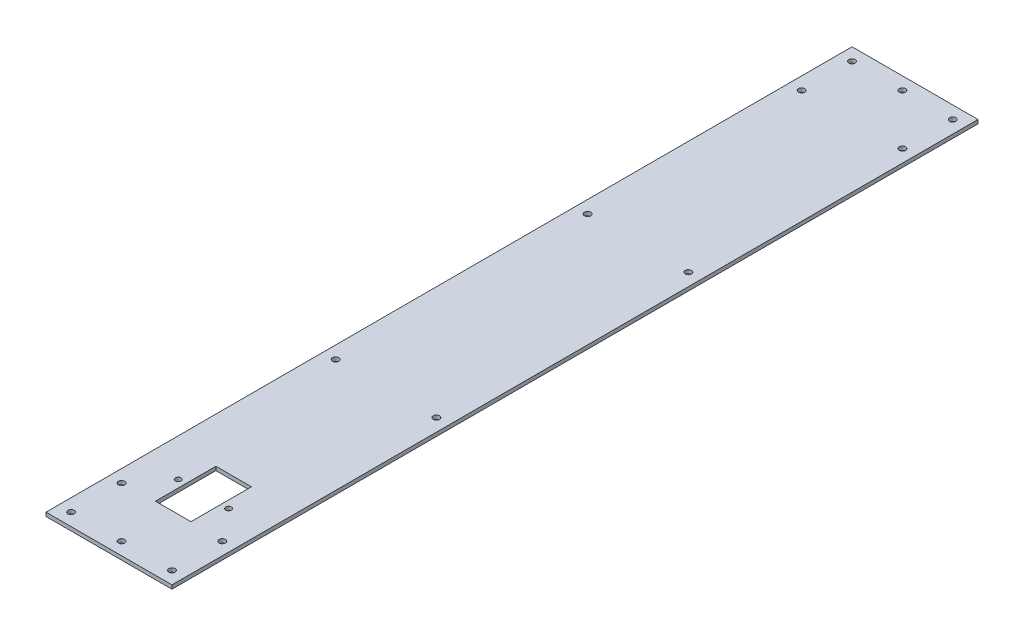
ISO-10303-21;
HEADER;
FILE_DESCRIPTION(('STEP AP214'),'2;1');
FILE_NAME('part.step','',(''),(''),'','','');
FILE_SCHEMA(('AUTOMOTIVE_DESIGN { 1 0 10303 214 1 1 1 1 }'));
ENDSEC;
DATA;
#1=APPLICATION_CONTEXT('core data for automotive mechanical design processes');
#2=APPLICATION_PROTOCOL_DEFINITION('international standard','automotive_design',2000,#1);
#3=PRODUCT_CONTEXT('',#1,'mechanical');
#4=PRODUCT('Part','Part','',(#3));
#5=PRODUCT_RELATED_PRODUCT_CATEGORY('part','',(#4));
#6=PRODUCT_DEFINITION_FORMATION('','',#4);
#7=PRODUCT_DEFINITION_CONTEXT('part definition',#1,'design');
#8=PRODUCT_DEFINITION('design','',#6,#7);
#9=PRODUCT_DEFINITION_SHAPE('','',#8);
#10=(LENGTH_UNIT() NAMED_UNIT(*) SI_UNIT(.MILLI.,.METRE.));
#11=(NAMED_UNIT(*) PLANE_ANGLE_UNIT() SI_UNIT($,.RADIAN.));
#12=(NAMED_UNIT(*) SI_UNIT($,.STERADIAN.) SOLID_ANGLE_UNIT());
#13=UNCERTAINTY_MEASURE_WITH_UNIT(LENGTH_MEASURE(1.E-05),#10,'distance_accuracy_value','');
#14=(GEOMETRIC_REPRESENTATION_CONTEXT(3) GLOBAL_UNCERTAINTY_ASSIGNED_CONTEXT((#13)) GLOBAL_UNIT_ASSIGNED_CONTEXT((#10,
#11,#12)) REPRESENTATION_CONTEXT('',''));
#15=CARTESIAN_POINT('',(0.,0.,0.));
#16=DIRECTION('',(0.,0.,1.));
#17=DIRECTION('',(1.,0.,0.));
#18=AXIS2_PLACEMENT_3D('',#15,#16,#17);
#19=CARTESIAN_POINT('',(0.,-3.,0.));
#20=DIRECTION('',(0.,-1.,0.));
#21=DIRECTION('',(1.,0.,0.));
#22=AXIS2_PLACEMENT_3D('',#19,#20,#21);
#23=PLANE('',#22);
#24=CARTESIAN_POINT('',(2.89,-3.,6.));
#25=DIRECTION('',(0.,-1.,0.));
#26=DIRECTION('',(0.,0.,-1.));
#27=AXIS2_PLACEMENT_3D('',#24,#25,#26);
#28=CIRCLE('',#27,2.25);
#29=CARTESIAN_POINT('',(2.89,-3.,3.75));
#30=VERTEX_POINT('',#29);
#31=EDGE_CURVE('E138',#30,#30,#28,.T.);
#32=ORIENTED_EDGE('',*,*,#31,.F.);
#33=EDGE_LOOP('',(#32));
#34=FACE_BOUND('',#33,.T.);
#35=CARTESIAN_POINT('',(42.89,-3.,6.));
#36=DIRECTION('',(0.,-1.,0.));
#37=DIRECTION('',(0.,0.,-1.));
#38=AXIS2_PLACEMENT_3D('',#35,#36,#37);
#39=CIRCLE('',#38,2.25);
#40=CARTESIAN_POINT('',(42.89,-3.,3.75));
#41=VERTEX_POINT('',#40);
#42=EDGE_CURVE('E135',#41,#41,#39,.T.);
#43=ORIENTED_EDGE('',*,*,#42,.F.);
#44=EDGE_LOOP('',(#43));
#45=FACE_BOUND('',#44,.T.);
#46=DIRECTION('',(0.,0.,-1.));
#47=VECTOR('',#46,1.);
#48=CARTESIAN_POINT('',(8.79,-3.,0.));
#49=LINE('',#48,#47);
#50=CARTESIAN_POINT('',(8.79,-3.,30.));
#51=VERTEX_POINT('',#50);
#52=CARTESIAN_POINT('',(8.79,-3.,-18.));
#53=VERTEX_POINT('',#52);
#54=EDGE_CURVE('E133',#51,#53,#49,.T.);
#55=ORIENTED_EDGE('',*,*,#54,.F.);
#56=DIRECTION('',(-1.,0.,0.));
#57=VECTOR('',#56,1.);
#58=CARTESIAN_POINT('',(0.,-3.,30.));
#59=LINE('',#58,#57);
#60=CARTESIAN_POINT('',(36.99,-3.,30.));
#61=VERTEX_POINT('',#60);
#62=EDGE_CURVE('E126',#61,#51,#59,.T.);
#63=ORIENTED_EDGE('',*,*,#62,.F.);
#64=DIRECTION('',(0.,0.,1.));
#65=VECTOR('',#64,1.);
#66=CARTESIAN_POINT('',(36.99,-3.,0.));
#67=LINE('',#66,#65);
#68=CARTESIAN_POINT('',(36.99,-3.,-18.));
#69=VERTEX_POINT('',#68);
#70=EDGE_CURVE('E106',#69,#61,#67,.T.);
#71=ORIENTED_EDGE('',*,*,#70,.F.);
#72=DIRECTION('',(1.,0.,0.));
#73=VECTOR('',#72,1.);
#74=CARTESIAN_POINT('',(0.,-3.,-18.));
#75=LINE('',#74,#73);
#76=EDGE_CURVE('E131',#53,#69,#75,.T.);
#77=ORIENTED_EDGE('',*,*,#76,.F.);
#78=EDGE_LOOP('',(#55,#63,#71,#77));
#79=FACE_BOUND('',#78,.T.);
#80=CARTESIAN_POINT('',(22.8925619834711,-3.,70.9917355371901));
#81=DIRECTION('',(0.,-1.,0.));
#82=DIRECTION('',(0.,0.,-1.));
#83=AXIS2_PLACEMENT_3D('',#80,#81,#82);
#84=CIRCLE('',#83,2.5);
#85=CARTESIAN_POINT('',(22.8925619834711,-3.,68.4917355371901));
#86=VERTEX_POINT('',#85);
#87=EDGE_CURVE('E11',#86,#86,#84,.T.);
#88=ORIENTED_EDGE('',*,*,#87,.F.);
#89=EDGE_LOOP('',(#88));
#90=FACE_BOUND('',#89,.T.);
#91=CARTESIAN_POINT('',(-17.1074380165289,-3.,30.9917355371901));
#92=DIRECTION('',(0.,-1.,0.));
#93=DIRECTION('',(0.,0.,-1.));
#94=AXIS2_PLACEMENT_3D('',#91,#92,#93);
#95=CIRCLE('',#94,2.5);
#96=CARTESIAN_POINT('',(-17.1074380165289,-3.,28.4917355371901));
#97=VERTEX_POINT('',#96);
#98=EDGE_CURVE('E43',#97,#97,#95,.T.);
#99=ORIENTED_EDGE('',*,*,#98,.F.);
#100=EDGE_LOOP('',(#99));
#101=FACE_BOUND('',#100,.T.);
#102=CARTESIAN_POINT('',(62.8925619834713,-3.,-509.00826446281));
#103=DIRECTION('',(0.,1.,0.));
#104=DIRECTION('',(0.,0.,-1.));
#105=AXIS2_PLACEMENT_3D('',#102,#103,#104);
#106=CIRCLE('',#105,2.5);
#107=CARTESIAN_POINT('',(62.8925619834713,-3.,-511.50826446281));
#108=VERTEX_POINT('',#107);
#109=EDGE_CURVE('E248',#108,#108,#106,.T.);
#110=ORIENTED_EDGE('',*,*,#109,.T.);
#111=EDGE_LOOP('',(#110));
#112=FACE_BOUND('',#111,.T.);
#113=CARTESIAN_POINT('',(22.8925619834712,-3.,-549.00826446281));
#114=DIRECTION('',(0.,-1.,0.));
#115=DIRECTION('',(0.,0.,-1.));
#116=AXIS2_PLACEMENT_3D('',#113,#114,#115);
#117=CIRCLE('',#116,2.49999999999994);
#118=CARTESIAN_POINT('',(22.8925619834712,-3.,-551.50826446281));
#119=VERTEX_POINT('',#118);
#120=EDGE_CURVE('E245',#119,#119,#117,.T.);
#121=ORIENTED_EDGE('',*,*,#120,.F.);
#122=EDGE_LOOP('',(#121));
#123=FACE_BOUND('',#122,.T.);
#124=CARTESIAN_POINT('',(-17.1074380165289,-3.,-509.00826446281));
#125=DIRECTION('',(0.,-1.,0.));
#126=DIRECTION('',(0.,0.,-1.));
#127=AXIS2_PLACEMENT_3D('',#124,#125,#126);
#128=CIRCLE('',#127,2.5);
#129=CARTESIAN_POINT('',(-17.1074380165289,-3.,-511.50826446281));
#130=VERTEX_POINT('',#129);
#131=EDGE_CURVE('E242',#130,#130,#128,.T.);
#132=ORIENTED_EDGE('',*,*,#131,.F.);
#133=EDGE_LOOP('',(#132));
#134=FACE_BOUND('',#133,.T.);
#135=CARTESIAN_POINT('',(62.8925619834712,-3.,-139.00826446281));
#136=DIRECTION('',(0.,1.,0.));
#137=DIRECTION('',(0.,0.,-1.));
#138=AXIS2_PLACEMENT_3D('',#135,#136,#137);
#139=CIRCLE('',#138,2.5);
#140=CARTESIAN_POINT('',(62.8925619834712,-3.,-141.50826446281));
#141=VERTEX_POINT('',#140);
#142=EDGE_CURVE('E239',#141,#141,#139,.T.);
#143=ORIENTED_EDGE('',*,*,#142,.T.);
#144=EDGE_LOOP('',(#143));
#145=FACE_BOUND('',#144,.T.);
#146=CARTESIAN_POINT('',(62.8925619834712,-3.,70.9917355371901));
#147=DIRECTION('',(0.,1.,0.));
#148=DIRECTION('',(0.,0.,-1.));
#149=AXIS2_PLACEMENT_3D('',#146,#147,#148);
#150=CIRCLE('',#149,2.5);
#151=CARTESIAN_POINT('',(62.8925619834712,-3.,68.4917355371901));
#152=VERTEX_POINT('',#151);
#153=EDGE_CURVE('E236',#152,#152,#150,.T.);
#154=ORIENTED_EDGE('',*,*,#153,.T.);
#155=EDGE_LOOP('',(#154));
#156=FACE_BOUND('',#155,.T.);
#157=CARTESIAN_POINT('',(-17.1074380165289,-3.,70.9917355371901));
#158=DIRECTION('',(0.,-1.,0.));
#159=DIRECTION('',(1.,0.,0.));
#160=AXIS2_PLACEMENT_3D('',#157,#158,#159);
#161=CIRCLE('',#160,2.5);
#162=CARTESIAN_POINT('',(-14.6074380165289,-3.,70.9917355371901));
#163=VERTEX_POINT('',#162);
#164=EDGE_CURVE('E233',#163,#163,#161,.T.);
#165=ORIENTED_EDGE('',*,*,#164,.F.);
#166=EDGE_LOOP('',(#165));
#167=FACE_BOUND('',#166,.T.);
#168=CARTESIAN_POINT('',(-17.1074380165289,-3.,-339.00826446281));
#169=DIRECTION('',(0.,-1.,0.));
#170=DIRECTION('',(1.,0.,0.));
#171=AXIS2_PLACEMENT_3D('',#168,#169,#170);
#172=CIRCLE('',#171,2.5);
#173=CARTESIAN_POINT('',(-14.6074380165289,-3.,-339.00826446281));
#174=VERTEX_POINT('',#173);
#175=EDGE_CURVE('E230',#174,#174,#172,.T.);
#176=ORIENTED_EDGE('',*,*,#175,.F.);
#177=EDGE_LOOP('',(#176));
#178=FACE_BOUND('',#177,.T.);
#179=CARTESIAN_POINT('',(-17.1074380165289,-3.,-549.00826446281));
#180=DIRECTION('',(0.,-1.,0.));
#181=DIRECTION('',(1.,0.,0.));
#182=AXIS2_PLACEMENT_3D('',#179,#180,#181);
#183=CIRCLE('',#182,2.5);
#184=CARTESIAN_POINT('',(-14.6074380165289,-3.,-549.00826446281));
#185=VERTEX_POINT('',#184);
#186=EDGE_CURVE('E227',#185,#185,#183,.T.);
#187=ORIENTED_EDGE('',*,*,#186,.F.);
#188=EDGE_LOOP('',(#187));
#189=FACE_BOUND('',#188,.T.);
#190=CARTESIAN_POINT('',(-17.1074380165289,-3.,-139.00826446281));
#191=DIRECTION('',(0.,-1.,0.));
#192=DIRECTION('',(1.,0.,0.));
#193=AXIS2_PLACEMENT_3D('',#190,#191,#192);
#194=CIRCLE('',#193,2.5);
#195=CARTESIAN_POINT('',(-14.6074380165289,-3.,-139.00826446281));
#196=VERTEX_POINT('',#195);
#197=EDGE_CURVE('E224',#196,#196,#194,.T.);
#198=ORIENTED_EDGE('',*,*,#197,.F.);
#199=EDGE_LOOP('',(#198));
#200=FACE_BOUND('',#199,.T.);
#201=DIRECTION('',(0.,0.,-1.));
#202=VECTOR('',#201,1.);
#203=CARTESIAN_POINT('',(-27.1074380165289,-3.,80.9917355371901));
#204=LINE('',#203,#202);
#205=CARTESIAN_POINT('',(-27.1074380165289,-3.,80.9917355371901));
#206=VERTEX_POINT('',#205);
#207=CARTESIAN_POINT('',(-27.1074380165288,-3.,-559.00826446281));
#208=VERTEX_POINT('',#207);
#209=EDGE_CURVE('E222',#206,#208,#204,.T.);
#210=ORIENTED_EDGE('',*,*,#209,.T.);
#211=DIRECTION('',(1.,0.,0.));
#212=VECTOR('',#211,1.);
#213=CARTESIAN_POINT('',(-27.1074380165288,-3.,-559.00826446281));
#214=LINE('',#213,#212);
#215=CARTESIAN_POINT('',(72.8925619834712,-3.,-559.00826446281));
#216=VERTEX_POINT('',#215);
#217=EDGE_CURVE('E220',#208,#216,#214,.T.);
#218=ORIENTED_EDGE('',*,*,#217,.T.);
#219=DIRECTION('',(0.,0.,1.));
#220=VECTOR('',#219,1.);
#221=CARTESIAN_POINT('',(72.8925619834711,-3.,80.9917355371901));
#222=LINE('',#221,#220);
#223=CARTESIAN_POINT('',(72.8925619834711,-3.,80.9917355371901));
#224=VERTEX_POINT('',#223);
#225=EDGE_CURVE('E218',#216,#224,#222,.T.);
#226=ORIENTED_EDGE('',*,*,#225,.T.);
#227=DIRECTION('',(-1.,0.,0.));
#228=VECTOR('',#227,1.);
#229=CARTESIAN_POINT('',(-27.1074380165289,-3.,80.9917355371901));
#230=LINE('',#229,#228);
#231=EDGE_CURVE('E216',#224,#206,#230,.T.);
#232=ORIENTED_EDGE('',*,*,#231,.T.);
#233=EDGE_LOOP('',(#210,#218,#226,#232));
#234=FACE_BOUND('',#233,.T.);
#235=CARTESIAN_POINT('',(62.8925619834712,-3.,-339.00826446281));
#236=DIRECTION('',(0.,-1.,0.));
#237=DIRECTION('',(0.,0.,-1.));
#238=AXIS2_PLACEMENT_3D('',#235,#236,#237);
#239=CIRCLE('',#238,2.5);
#240=CARTESIAN_POINT('',(62.8925619834712,-3.,-341.50826446281));
#241=VERTEX_POINT('',#240);
#242=EDGE_CURVE('E213',#241,#241,#239,.T.);
#243=ORIENTED_EDGE('',*,*,#242,.F.);
#244=EDGE_LOOP('',(#243));
#245=FACE_BOUND('',#244,.T.);
#246=CARTESIAN_POINT('',(62.8925619834712,-3.,-549.00826446281));
#247=DIRECTION('',(0.,-1.,0.));
#248=DIRECTION('',(0.,0.,-1.));
#249=AXIS2_PLACEMENT_3D('',#246,#247,#248);
#250=CIRCLE('',#249,2.5);
#251=CARTESIAN_POINT('',(62.8925619834712,-3.,-551.50826446281));
#252=VERTEX_POINT('',#251);
#253=EDGE_CURVE('E210',#252,#252,#250,.T.);
#254=ORIENTED_EDGE('',*,*,#253,.F.);
#255=EDGE_LOOP('',(#254));
#256=FACE_BOUND('',#255,.T.);
#257=CARTESIAN_POINT('',(62.8925619834711,-3.,30.9917355371901));
#258=DIRECTION('',(0.,1.,0.));
#259=DIRECTION('',(0.,0.,-1.));
#260=AXIS2_PLACEMENT_3D('',#257,#258,#259);
#261=CIRCLE('',#260,2.5);
#262=CARTESIAN_POINT('',(62.8925619834711,-3.,28.4917355371901));
#263=VERTEX_POINT('',#262);
#264=EDGE_CURVE('E207',#263,#263,#261,.T.);
#265=ORIENTED_EDGE('',*,*,#264,.T.);
#266=EDGE_LOOP('',(#265));
#267=FACE_BOUND('',#266,.T.);
#268=ADVANCED_FACE('F36',(#34,#45,#79,#90,#101,#112,#123,#134,#145,#156,#167,#178,#189,#200,
#234,#245,#256,#267),#23,.T.);
#269=CARTESIAN_POINT('',(0.,0.,0.));
#270=DIRECTION('',(0.,-1.,0.));
#271=DIRECTION('',(1.,0.,0.));
#272=AXIS2_PLACEMENT_3D('',#269,#270,#271);
#273=PLANE('',#272);
#274=CARTESIAN_POINT('',(2.89,0.,6.));
#275=DIRECTION('',(0.,1.,0.));
#276=DIRECTION('',(0.,0.,1.));
#277=AXIS2_PLACEMENT_3D('',#274,#275,#276);
#278=CIRCLE('',#277,2.25);
#279=CARTESIAN_POINT('',(2.89,0.,8.25));
#280=VERTEX_POINT('',#279);
#281=EDGE_CURVE('E390',#280,#280,#278,.T.);
#282=ORIENTED_EDGE('',*,*,#281,.F.);
#283=EDGE_LOOP('',(#282));
#284=FACE_BOUND('',#283,.T.);
#285=CARTESIAN_POINT('',(42.89,0.,6.));
#286=DIRECTION('',(0.,1.,0.));
#287=DIRECTION('',(0.,0.,1.));
#288=AXIS2_PLACEMENT_3D('',#285,#286,#287);
#289=CIRCLE('',#288,2.25);
#290=CARTESIAN_POINT('',(42.89,0.,8.25));
#291=VERTEX_POINT('',#290);
#292=EDGE_CURVE('E389',#291,#291,#289,.T.);
#293=ORIENTED_EDGE('',*,*,#292,.F.);
#294=EDGE_LOOP('',(#293));
#295=FACE_BOUND('',#294,.T.);
#296=DIRECTION('',(1.,0.,0.));
#297=VECTOR('',#296,1.);
#298=CARTESIAN_POINT('',(8.79,0.,30.));
#299=LINE('',#298,#297);
#300=CARTESIAN_POINT('',(8.79,0.,30.));
#301=VERTEX_POINT('',#300);
#302=CARTESIAN_POINT('',(36.99,0.,30.));
#303=VERTEX_POINT('',#302);
#304=EDGE_CURVE('E112',#301,#303,#299,.T.);
#305=ORIENTED_EDGE('',*,*,#304,.F.);
#306=DIRECTION('',(0.,0.,1.));
#307=VECTOR('',#306,1.);
#308=CARTESIAN_POINT('',(8.79,0.,-18.));
#309=LINE('',#308,#307);
#310=CARTESIAN_POINT('',(8.79,0.,-18.));
#311=VERTEX_POINT('',#310);
#312=EDGE_CURVE('E58',#311,#301,#309,.T.);
#313=ORIENTED_EDGE('',*,*,#312,.F.);
#314=DIRECTION('',(-1.,0.,0.));
#315=VECTOR('',#314,1.);
#316=CARTESIAN_POINT('',(8.79,0.,-18.));
#317=LINE('',#316,#315);
#318=CARTESIAN_POINT('',(36.99,0.,-18.));
#319=VERTEX_POINT('',#318);
#320=EDGE_CURVE('E119',#319,#311,#317,.T.);
#321=ORIENTED_EDGE('',*,*,#320,.F.);
#322=DIRECTION('',(0.,0.,-1.));
#323=VECTOR('',#322,1.);
#324=CARTESIAN_POINT('',(36.99,0.,-18.));
#325=LINE('',#324,#323);
#326=EDGE_CURVE('E103',#303,#319,#325,.T.);
#327=ORIENTED_EDGE('',*,*,#326,.F.);
#328=EDGE_LOOP('',(#305,#313,#321,#327));
#329=FACE_BOUND('',#328,.T.);
#330=CARTESIAN_POINT('',(22.8925619834711,0.,70.9917355371901));
#331=DIRECTION('',(0.,-1.,0.));
#332=DIRECTION('',(0.,0.,-1.));
#333=AXIS2_PLACEMENT_3D('',#330,#331,#332);
#334=CIRCLE('',#333,2.5);
#335=CARTESIAN_POINT('',(22.8925619834711,0.,68.4917355371901));
#336=VERTEX_POINT('',#335);
#337=EDGE_CURVE('E204',#336,#336,#334,.T.);
#338=ORIENTED_EDGE('',*,*,#337,.T.);
#339=EDGE_LOOP('',(#338));
#340=FACE_BOUND('',#339,.T.);
#341=CARTESIAN_POINT('',(-17.1074380165289,0.,30.9917355371901));
#342=DIRECTION('',(0.,-1.,0.));
#343=DIRECTION('',(0.,0.,-1.));
#344=AXIS2_PLACEMENT_3D('',#341,#342,#343);
#345=CIRCLE('',#344,2.5);
#346=CARTESIAN_POINT('',(-17.1074380165289,0.,28.4917355371901));
#347=VERTEX_POINT('',#346);
#348=EDGE_CURVE('E201',#347,#347,#345,.T.);
#349=ORIENTED_EDGE('',*,*,#348,.T.);
#350=EDGE_LOOP('',(#349));
#351=FACE_BOUND('',#350,.T.);
#352=CARTESIAN_POINT('',(22.8925619834712,0.,-549.00826446281));
#353=DIRECTION('',(0.,-1.,0.));
#354=DIRECTION('',(0.,0.,-1.));
#355=AXIS2_PLACEMENT_3D('',#352,#353,#354);
#356=CIRCLE('',#355,2.49999999999994);
#357=CARTESIAN_POINT('',(22.8925619834712,0.,-551.50826446281));
#358=VERTEX_POINT('',#357);
#359=EDGE_CURVE('E198',#358,#358,#356,.T.);
#360=ORIENTED_EDGE('',*,*,#359,.T.);
#361=EDGE_LOOP('',(#360));
#362=FACE_BOUND('',#361,.T.);
#363=CARTESIAN_POINT('',(-17.1074380165289,0.,-509.00826446281));
#364=DIRECTION('',(0.,-1.,0.));
#365=DIRECTION('',(0.,0.,-1.));
#366=AXIS2_PLACEMENT_3D('',#363,#364,#365);
#367=CIRCLE('',#366,2.5);
#368=CARTESIAN_POINT('',(-17.1074380165289,0.,-511.50826446281));
#369=VERTEX_POINT('',#368);
#370=EDGE_CURVE('E195',#369,#369,#367,.T.);
#371=ORIENTED_EDGE('',*,*,#370,.T.);
#372=EDGE_LOOP('',(#371));
#373=FACE_BOUND('',#372,.T.);
#374=CARTESIAN_POINT('',(62.8925619834712,0.,-339.00826446281));
#375=DIRECTION('',(0.,-1.,0.));
#376=DIRECTION('',(0.,0.,-1.));
#377=AXIS2_PLACEMENT_3D('',#374,#375,#376);
#378=CIRCLE('',#377,2.5);
#379=CARTESIAN_POINT('',(62.8925619834712,0.,-341.50826446281));
#380=VERTEX_POINT('',#379);
#381=EDGE_CURVE('E192',#380,#380,#378,.T.);
#382=ORIENTED_EDGE('',*,*,#381,.T.);
#383=EDGE_LOOP('',(#382));
#384=FACE_BOUND('',#383,.T.);
#385=CARTESIAN_POINT('',(62.8925619834712,0.,-139.00826446281));
#386=DIRECTION('',(0.,-1.,0.));
#387=DIRECTION('',(0.,0.,-1.));
#388=AXIS2_PLACEMENT_3D('',#385,#386,#387);
#389=CIRCLE('',#388,2.5);
#390=CARTESIAN_POINT('',(62.8925619834712,0.,-141.50826446281));
#391=VERTEX_POINT('',#390);
#392=EDGE_CURVE('E189',#391,#391,#389,.F.);
#393=ORIENTED_EDGE('',*,*,#392,.F.);
#394=EDGE_LOOP('',(#393));
#395=FACE_BOUND('',#394,.T.);
#396=CARTESIAN_POINT('',(62.8925619834712,0.,70.9917355371901));
#397=DIRECTION('',(0.,-1.,0.));
#398=DIRECTION('',(0.,0.,-1.));
#399=AXIS2_PLACEMENT_3D('',#396,#397,#398);
#400=CIRCLE('',#399,2.5);
#401=CARTESIAN_POINT('',(62.8925619834712,0.,68.4917355371901));
#402=VERTEX_POINT('',#401);
#403=EDGE_CURVE('E186',#402,#402,#400,.F.);
#404=ORIENTED_EDGE('',*,*,#403,.F.);
#405=EDGE_LOOP('',(#404));
#406=FACE_BOUND('',#405,.T.);
#407=CARTESIAN_POINT('',(-17.1074380165289,0.,70.9917355371901));
#408=DIRECTION('',(0.,-1.,0.));
#409=DIRECTION('',(1.,0.,0.));
#410=AXIS2_PLACEMENT_3D('',#407,#408,#409);
#411=CIRCLE('',#410,2.5);
#412=CARTESIAN_POINT('',(-14.6074380165289,0.,70.9917355371901));
#413=VERTEX_POINT('',#412);
#414=EDGE_CURVE('E183',#413,#413,#411,.T.);
#415=ORIENTED_EDGE('',*,*,#414,.T.);
#416=EDGE_LOOP('',(#415));
#417=FACE_BOUND('',#416,.T.);
#418=CARTESIAN_POINT('',(-17.1074380165289,0.,-339.00826446281));
#419=DIRECTION('',(0.,-1.,0.));
#420=DIRECTION('',(1.,0.,0.));
#421=AXIS2_PLACEMENT_3D('',#418,#419,#420);
#422=CIRCLE('',#421,2.5);
#423=CARTESIAN_POINT('',(-14.6074380165289,0.,-339.00826446281));
#424=VERTEX_POINT('',#423);
#425=EDGE_CURVE('E180',#424,#424,#422,.T.);
#426=ORIENTED_EDGE('',*,*,#425,.T.);
#427=EDGE_LOOP('',(#426));
#428=FACE_BOUND('',#427,.T.);
#429=CARTESIAN_POINT('',(-17.1074380165289,0.,-549.00826446281));
#430=DIRECTION('',(0.,-1.,0.));
#431=DIRECTION('',(1.,0.,0.));
#432=AXIS2_PLACEMENT_3D('',#429,#430,#431);
#433=CIRCLE('',#432,2.5);
#434=CARTESIAN_POINT('',(-14.6074380165289,0.,-549.00826446281));
#435=VERTEX_POINT('',#434);
#436=EDGE_CURVE('E177',#435,#435,#433,.T.);
#437=ORIENTED_EDGE('',*,*,#436,.T.);
#438=EDGE_LOOP('',(#437));
#439=FACE_BOUND('',#438,.T.);
#440=CARTESIAN_POINT('',(-17.1074380165289,0.,-139.00826446281));
#441=DIRECTION('',(0.,-1.,0.));
#442=DIRECTION('',(1.,0.,0.));
#443=AXIS2_PLACEMENT_3D('',#440,#441,#442);
#444=CIRCLE('',#443,2.5);
#445=CARTESIAN_POINT('',(-14.6074380165289,0.,-139.00826446281));
#446=VERTEX_POINT('',#445);
#447=EDGE_CURVE('E174',#446,#446,#444,.T.);
#448=ORIENTED_EDGE('',*,*,#447,.T.);
#449=EDGE_LOOP('',(#448));
#450=FACE_BOUND('',#449,.T.);
#451=DIRECTION('',(0.,0.,-1.));
#452=VECTOR('',#451,1.);
#453=CARTESIAN_POINT('',(-27.1074380165289,0.,80.9917355371901));
#454=LINE('',#453,#452);
#455=CARTESIAN_POINT('',(-27.1074380165289,0.,80.9917355371901));
#456=VERTEX_POINT('',#455);
#457=CARTESIAN_POINT('',(-27.1074380165288,0.,-559.00826446281));
#458=VERTEX_POINT('',#457);
#459=EDGE_CURVE('E171',#456,#458,#454,.T.);
#460=ORIENTED_EDGE('',*,*,#459,.F.);
#461=DIRECTION('',(-1.,0.,0.));
#462=VECTOR('',#461,1.);
#463=CARTESIAN_POINT('',(-27.1074380165289,0.,80.9917355371901));
#464=LINE('',#463,#462);
#465=CARTESIAN_POINT('',(72.8925619834711,0.,80.9917355371901));
#466=VERTEX_POINT('',#465);
#467=EDGE_CURVE('E168',#466,#456,#464,.T.);
#468=ORIENTED_EDGE('',*,*,#467,.F.);
#469=DIRECTION('',(0.,0.,1.));
#470=VECTOR('',#469,1.);
#471=CARTESIAN_POINT('',(72.8925619834711,0.,80.9917355371901));
#472=LINE('',#471,#470);
#473=CARTESIAN_POINT('',(72.8925619834712,0.,-559.00826446281));
#474=VERTEX_POINT('',#473);
#475=EDGE_CURVE('E165',#474,#466,#472,.T.);
#476=ORIENTED_EDGE('',*,*,#475,.F.);
#477=DIRECTION('',(1.,0.,0.));
#478=VECTOR('',#477,1.);
#479=CARTESIAN_POINT('',(-27.1074380165288,0.,-559.00826446281));
#480=LINE('',#479,#478);
#481=EDGE_CURVE('E162',#458,#474,#480,.T.);
#482=ORIENTED_EDGE('',*,*,#481,.F.);
#483=EDGE_LOOP('',(#460,#468,#476,#482));
#484=FACE_BOUND('',#483,.T.);
#485=CARTESIAN_POINT('',(62.8925619834712,0.,-549.00826446281));
#486=DIRECTION('',(0.,-1.,0.));
#487=DIRECTION('',(0.,0.,-1.));
#488=AXIS2_PLACEMENT_3D('',#485,#486,#487);
#489=CIRCLE('',#488,2.5);
#490=CARTESIAN_POINT('',(62.8925619834712,0.,-551.50826446281));
#491=VERTEX_POINT('',#490);
#492=EDGE_CURVE('E159',#491,#491,#489,.T.);
#493=ORIENTED_EDGE('',*,*,#492,.T.);
#494=EDGE_LOOP('',(#493));
#495=FACE_BOUND('',#494,.T.);
#496=CARTESIAN_POINT('',(62.8925619834713,0.,-509.00826446281));
#497=DIRECTION('',(0.,-1.,0.));
#498=DIRECTION('',(0.,0.,-1.));
#499=AXIS2_PLACEMENT_3D('',#496,#497,#498);
#500=CIRCLE('',#499,2.5);
#501=CARTESIAN_POINT('',(62.8925619834713,0.,-511.50826446281));
#502=VERTEX_POINT('',#501);
#503=EDGE_CURVE('E156',#502,#502,#500,.F.);
#504=ORIENTED_EDGE('',*,*,#503,.F.);
#505=EDGE_LOOP('',(#504));
#506=FACE_BOUND('',#505,.T.);
#507=CARTESIAN_POINT('',(62.8925619834711,0.,30.9917355371901));
#508=DIRECTION('',(0.,-1.,0.));
#509=DIRECTION('',(0.,0.,-1.));
#510=AXIS2_PLACEMENT_3D('',#507,#508,#509);
#511=CIRCLE('',#510,2.5);
#512=CARTESIAN_POINT('',(62.8925619834711,0.,28.4917355371901));
#513=VERTEX_POINT('',#512);
#514=EDGE_CURVE('E153',#513,#513,#511,.F.);
#515=ORIENTED_EDGE('',*,*,#514,.F.);
#516=EDGE_LOOP('',(#515));
#517=FACE_BOUND('',#516,.T.);
#518=ADVANCED_FACE('F116',(#284,#295,#329,#340,#351,#362,#373,#384,#395,#406,#417,#428,#439,
#450,#484,#495,#506,#517),#273,.F.);
#519=CARTESIAN_POINT('',(-27.1074380165289,-3.,80.9917355371901));
#520=DIRECTION('',(1.,0.,0.));
#521=DIRECTION('',(0.,0.,1.));
#522=AXIS2_PLACEMENT_3D('',#519,#520,#521);
#523=PLANE('',#522);
#524=ORIENTED_EDGE('',*,*,#459,.T.);
#525=DIRECTION('',(0.,1.,0.));
#526=VECTOR('',#525,1.);
#527=CARTESIAN_POINT('',(-27.1074380165288,-3.,-559.00826446281));
#528=LINE('',#527,#526);
#529=EDGE_CURVE('E150',#208,#458,#528,.T.);
#530=ORIENTED_EDGE('',*,*,#529,.F.);
#531=ORIENTED_EDGE('',*,*,#209,.F.);
#532=DIRECTION('',(0.,1.,0.));
#533=VECTOR('',#532,1.);
#534=CARTESIAN_POINT('',(-27.1074380165289,-3.,80.9917355371901));
#535=LINE('',#534,#533);
#536=EDGE_CURVE('E147',#206,#456,#535,.T.);
#537=ORIENTED_EDGE('',*,*,#536,.T.);
#538=EDGE_LOOP('',(#524,#530,#531,#537));
#539=FACE_BOUND('',#538,.T.);
#540=ADVANCED_FACE('F294',(#539),#523,.F.);
#541=CARTESIAN_POINT('',(-27.1074380165288,-3.,-559.00826446281));
#542=DIRECTION('',(0.,0.,1.));
#543=DIRECTION('',(0.,-1.,0.));
#544=AXIS2_PLACEMENT_3D('',#541,#542,#543);
#545=PLANE('',#544);
#546=ORIENTED_EDGE('',*,*,#481,.T.);
#547=DIRECTION('',(0.,1.,0.));
#548=VECTOR('',#547,1.);
#549=CARTESIAN_POINT('',(72.8925619834712,-3.,-559.00826446281));
#550=LINE('',#549,#548);
#551=EDGE_CURVE('E144',#216,#474,#550,.T.);
#552=ORIENTED_EDGE('',*,*,#551,.F.);
#553=ORIENTED_EDGE('',*,*,#217,.F.);
#554=ORIENTED_EDGE('',*,*,#529,.T.);
#555=EDGE_LOOP('',(#546,#552,#553,#554));
#556=FACE_BOUND('',#555,.T.);
#557=ADVANCED_FACE('F299',(#556),#545,.F.);
#558=CARTESIAN_POINT('',(-27.1074380165289,-3.,80.9917355371901));
#559=DIRECTION('',(0.,0.,-1.));
#560=DIRECTION('',(0.,1.,0.));
#561=AXIS2_PLACEMENT_3D('',#558,#559,#560);
#562=PLANE('',#561);
#563=ORIENTED_EDGE('',*,*,#467,.T.);
#564=ORIENTED_EDGE('',*,*,#536,.F.);
#565=ORIENTED_EDGE('',*,*,#231,.F.);
#566=DIRECTION('',(0.,1.,0.));
#567=VECTOR('',#566,1.);
#568=CARTESIAN_POINT('',(72.8925619834711,-3.,80.9917355371901));
#569=LINE('',#568,#567);
#570=EDGE_CURVE('E141',#224,#466,#569,.T.);
#571=ORIENTED_EDGE('',*,*,#570,.T.);
#572=EDGE_LOOP('',(#563,#564,#565,#571));
#573=FACE_BOUND('',#572,.T.);
#574=ADVANCED_FACE('F307',(#573),#562,.F.);
#575=CARTESIAN_POINT('',(-17.1074380165289,0.,-139.00826446281));
#576=DIRECTION('',(0.,-1.,0.));
#577=DIRECTION('',(1.,0.,0.));
#578=AXIS2_PLACEMENT_3D('',#575,#576,#577);
#579=CYLINDRICAL_SURFACE('',#578,2.5);
#580=ORIENTED_EDGE('',*,*,#447,.F.);
#581=EDGE_LOOP('',(#580));
#582=FACE_BOUND('',#581,.T.);
#583=ORIENTED_EDGE('',*,*,#197,.T.);
#584=EDGE_LOOP('',(#583));
#585=FACE_BOUND('',#584,.T.);
#586=ADVANCED_FACE('F311',(#582,#585),#579,.F.);
#587=CARTESIAN_POINT('',(-17.1074380165289,0.,-549.00826446281));
#588=DIRECTION('',(0.,-1.,0.));
#589=DIRECTION('',(1.,0.,0.));
#590=AXIS2_PLACEMENT_3D('',#587,#588,#589);
#591=CYLINDRICAL_SURFACE('',#590,2.5);
#592=ORIENTED_EDGE('',*,*,#436,.F.);
#593=EDGE_LOOP('',(#592));
#594=FACE_BOUND('',#593,.T.);
#595=ORIENTED_EDGE('',*,*,#186,.T.);
#596=EDGE_LOOP('',(#595));
#597=FACE_BOUND('',#596,.T.);
#598=ADVANCED_FACE('F315',(#594,#597),#591,.F.);
#599=CARTESIAN_POINT('',(-17.1074380165289,0.,-339.00826446281));
#600=DIRECTION('',(0.,-1.,0.));
#601=DIRECTION('',(1.,0.,0.));
#602=AXIS2_PLACEMENT_3D('',#599,#600,#601);
#603=CYLINDRICAL_SURFACE('',#602,2.5);
#604=ORIENTED_EDGE('',*,*,#425,.F.);
#605=EDGE_LOOP('',(#604));
#606=FACE_BOUND('',#605,.T.);
#607=ORIENTED_EDGE('',*,*,#175,.T.);
#608=EDGE_LOOP('',(#607));
#609=FACE_BOUND('',#608,.T.);
#610=ADVANCED_FACE('F319',(#606,#609),#603,.F.);
#611=CARTESIAN_POINT('',(-17.1074380165289,0.,70.9917355371901));
#612=DIRECTION('',(0.,-1.,0.));
#613=DIRECTION('',(1.,0.,0.));
#614=AXIS2_PLACEMENT_3D('',#611,#612,#613);
#615=CYLINDRICAL_SURFACE('',#614,2.5);
#616=ORIENTED_EDGE('',*,*,#414,.F.);
#617=EDGE_LOOP('',(#616));
#618=FACE_BOUND('',#617,.T.);
#619=ORIENTED_EDGE('',*,*,#164,.T.);
#620=EDGE_LOOP('',(#619));
#621=FACE_BOUND('',#620,.T.);
#622=ADVANCED_FACE('F323',(#618,#621),#615,.F.);
#623=CARTESIAN_POINT('',(72.8925619834711,-3.,80.9917355371901));
#624=DIRECTION('',(-1.,0.,0.));
#625=DIRECTION('',(0.,0.,-1.));
#626=AXIS2_PLACEMENT_3D('',#623,#624,#625);
#627=PLANE('',#626);
#628=ORIENTED_EDGE('',*,*,#475,.T.);
#629=ORIENTED_EDGE('',*,*,#570,.F.);
#630=ORIENTED_EDGE('',*,*,#225,.F.);
#631=ORIENTED_EDGE('',*,*,#551,.T.);
#632=EDGE_LOOP('',(#628,#629,#630,#631));
#633=FACE_BOUND('',#632,.T.);
#634=ADVANCED_FACE('F327',(#633),#627,.F.);
#635=CARTESIAN_POINT('',(62.8925619834712,22.,70.9917355371901));
#636=DIRECTION('',(0.,-1.,0.));
#637=DIRECTION('',(0.,0.,-1.));
#638=AXIS2_PLACEMENT_3D('',#635,#636,#637);
#639=CYLINDRICAL_SURFACE('',#638,2.5);
#640=ORIENTED_EDGE('',*,*,#153,.F.);
#641=EDGE_LOOP('',(#640));
#642=FACE_BOUND('',#641,.T.);
#643=ORIENTED_EDGE('',*,*,#403,.T.);
#644=EDGE_LOOP('',(#643));
#645=FACE_BOUND('',#644,.T.);
#646=ADVANCED_FACE('F331',(#642,#645),#639,.F.);
#647=CARTESIAN_POINT('',(62.8925619834712,22.,-139.00826446281));
#648=DIRECTION('',(0.,-1.,0.));
#649=DIRECTION('',(0.,0.,-1.));
#650=AXIS2_PLACEMENT_3D('',#647,#648,#649);
#651=CYLINDRICAL_SURFACE('',#650,2.5);
#652=ORIENTED_EDGE('',*,*,#142,.F.);
#653=EDGE_LOOP('',(#652));
#654=FACE_BOUND('',#653,.T.);
#655=ORIENTED_EDGE('',*,*,#392,.T.);
#656=EDGE_LOOP('',(#655));
#657=FACE_BOUND('',#656,.T.);
#658=ADVANCED_FACE('F335',(#654,#657),#651,.F.);
#659=CARTESIAN_POINT('',(62.8925619834712,22.,-339.00826446281));
#660=DIRECTION('',(0.,-1.,0.));
#661=DIRECTION('',(0.,0.,-1.));
#662=AXIS2_PLACEMENT_3D('',#659,#660,#661);
#663=CYLINDRICAL_SURFACE('',#662,2.5);
#664=ORIENTED_EDGE('',*,*,#242,.T.);
#665=EDGE_LOOP('',(#664));
#666=FACE_BOUND('',#665,.T.);
#667=ORIENTED_EDGE('',*,*,#381,.F.);
#668=EDGE_LOOP('',(#667));
#669=FACE_BOUND('',#668,.T.);
#670=ADVANCED_FACE('F339',(#666,#669),#663,.F.);
#671=CARTESIAN_POINT('',(62.8925619834712,22.,-549.00826446281));
#672=DIRECTION('',(0.,-1.,0.));
#673=DIRECTION('',(0.,0.,-1.));
#674=AXIS2_PLACEMENT_3D('',#671,#672,#673);
#675=CYLINDRICAL_SURFACE('',#674,2.5);
#676=ORIENTED_EDGE('',*,*,#253,.T.);
#677=EDGE_LOOP('',(#676));
#678=FACE_BOUND('',#677,.T.);
#679=ORIENTED_EDGE('',*,*,#492,.F.);
#680=EDGE_LOOP('',(#679));
#681=FACE_BOUND('',#680,.T.);
#682=ADVANCED_FACE('F343',(#678,#681),#675,.F.);
#683=CARTESIAN_POINT('',(-17.1074380165289,22.,-509.00826446281));
#684=DIRECTION('',(0.,-1.,0.));
#685=DIRECTION('',(0.,0.,-1.));
#686=AXIS2_PLACEMENT_3D('',#683,#684,#685);
#687=CYLINDRICAL_SURFACE('',#686,2.5);
#688=ORIENTED_EDGE('',*,*,#131,.T.);
#689=EDGE_LOOP('',(#688));
#690=FACE_BOUND('',#689,.T.);
#691=ORIENTED_EDGE('',*,*,#370,.F.);
#692=EDGE_LOOP('',(#691));
#693=FACE_BOUND('',#692,.T.);
#694=ADVANCED_FACE('F347',(#690,#693),#687,.F.);
#695=CARTESIAN_POINT('',(22.8925619834712,22.,-549.00826446281));
#696=DIRECTION('',(0.,-1.,0.));
#697=DIRECTION('',(0.,0.,-1.));
#698=AXIS2_PLACEMENT_3D('',#695,#696,#697);
#699=CYLINDRICAL_SURFACE('',#698,2.49999999999994);
#700=ORIENTED_EDGE('',*,*,#120,.T.);
#701=EDGE_LOOP('',(#700));
#702=FACE_BOUND('',#701,.T.);
#703=ORIENTED_EDGE('',*,*,#359,.F.);
#704=EDGE_LOOP('',(#703));
#705=FACE_BOUND('',#704,.T.);
#706=ADVANCED_FACE('F351',(#702,#705),#699,.F.);
#707=CARTESIAN_POINT('',(62.8925619834713,22.,-509.00826446281));
#708=DIRECTION('',(0.,-1.,0.));
#709=DIRECTION('',(0.,0.,-1.));
#710=AXIS2_PLACEMENT_3D('',#707,#708,#709);
#711=CYLINDRICAL_SURFACE('',#710,2.5);
#712=ORIENTED_EDGE('',*,*,#109,.F.);
#713=EDGE_LOOP('',(#712));
#714=FACE_BOUND('',#713,.T.);
#715=ORIENTED_EDGE('',*,*,#503,.T.);
#716=EDGE_LOOP('',(#715));
#717=FACE_BOUND('',#716,.T.);
#718=ADVANCED_FACE('F289',(#714,#717),#711,.F.);
#719=CARTESIAN_POINT('',(62.8925619834711,22.,30.9917355371901));
#720=DIRECTION('',(0.,-1.,0.));
#721=DIRECTION('',(0.,0.,-1.));
#722=AXIS2_PLACEMENT_3D('',#719,#720,#721);
#723=CYLINDRICAL_SURFACE('',#722,2.5);
#724=ORIENTED_EDGE('',*,*,#264,.F.);
#725=EDGE_LOOP('',(#724));
#726=FACE_BOUND('',#725,.T.);
#727=ORIENTED_EDGE('',*,*,#514,.T.);
#728=EDGE_LOOP('',(#727));
#729=FACE_BOUND('',#728,.T.);
#730=ADVANCED_FACE('F286',(#726,#729),#723,.F.);
#731=CARTESIAN_POINT('',(-17.1074380165289,22.,30.9917355371901));
#732=DIRECTION('',(0.,-1.,0.));
#733=DIRECTION('',(0.,0.,-1.));
#734=AXIS2_PLACEMENT_3D('',#731,#732,#733);
#735=CYLINDRICAL_SURFACE('',#734,2.5);
#736=ORIENTED_EDGE('',*,*,#98,.T.);
#737=EDGE_LOOP('',(#736));
#738=FACE_BOUND('',#737,.T.);
#739=ORIENTED_EDGE('',*,*,#348,.F.);
#740=EDGE_LOOP('',(#739));
#741=FACE_BOUND('',#740,.T.);
#742=ADVANCED_FACE('F253',(#738,#741),#735,.F.);
#743=CARTESIAN_POINT('',(22.8925619834711,22.,70.9917355371901));
#744=DIRECTION('',(0.,-1.,0.));
#745=DIRECTION('',(0.,0.,-1.));
#746=AXIS2_PLACEMENT_3D('',#743,#744,#745);
#747=CYLINDRICAL_SURFACE('',#746,2.5);
#748=ORIENTED_EDGE('',*,*,#87,.T.);
#749=EDGE_LOOP('',(#748));
#750=FACE_BOUND('',#749,.T.);
#751=ORIENTED_EDGE('',*,*,#337,.F.);
#752=EDGE_LOOP('',(#751));
#753=FACE_BOUND('',#752,.T.);
#754=ADVANCED_FACE('F361',(#750,#753),#747,.F.);
#755=CARTESIAN_POINT('',(8.79,-10.,-18.));
#756=DIRECTION('',(-1.,0.,0.));
#757=DIRECTION('',(0.,0.,1.));
#758=AXIS2_PLACEMENT_3D('',#755,#756,#757);
#759=PLANE('',#758);
#760=ORIENTED_EDGE('',*,*,#54,.T.);
#761=DIRECTION('',(0.,1.,0.));
#762=VECTOR('',#761,1.);
#763=CARTESIAN_POINT('',(8.79,-10.,-18.));
#764=LINE('',#763,#762);
#765=EDGE_CURVE('E124',#53,#311,#764,.T.);
#766=ORIENTED_EDGE('',*,*,#765,.T.);
#767=ORIENTED_EDGE('',*,*,#312,.T.);
#768=DIRECTION('',(0.,1.,0.));
#769=VECTOR('',#768,1.);
#770=CARTESIAN_POINT('',(8.79,-10.,30.));
#771=LINE('',#770,#769);
#772=EDGE_CURVE('E109',#51,#301,#771,.T.);
#773=ORIENTED_EDGE('',*,*,#772,.F.);
#774=EDGE_LOOP('',(#760,#766,#767,#773));
#775=FACE_BOUND('',#774,.T.);
#776=ADVANCED_FACE('F364',(#775),#759,.F.);
#777=CARTESIAN_POINT('',(8.79,-10.,-18.));
#778=DIRECTION('',(0.,0.,-1.));
#779=DIRECTION('',(-1.,0.,0.));
#780=AXIS2_PLACEMENT_3D('',#777,#778,#779);
#781=PLANE('',#780);
#782=ORIENTED_EDGE('',*,*,#76,.T.);
#783=DIRECTION('',(0.,1.,0.));
#784=VECTOR('',#783,1.);
#785=CARTESIAN_POINT('',(36.99,-10.,-18.));
#786=LINE('',#785,#784);
#787=EDGE_CURVE('E108',#69,#319,#786,.T.);
#788=ORIENTED_EDGE('',*,*,#787,.T.);
#789=ORIENTED_EDGE('',*,*,#320,.T.);
#790=ORIENTED_EDGE('',*,*,#765,.F.);
#791=EDGE_LOOP('',(#782,#788,#789,#790));
#792=FACE_BOUND('',#791,.T.);
#793=ADVANCED_FACE('F368',(#792),#781,.F.);
#794=CARTESIAN_POINT('',(36.99,-10.,-18.));
#795=DIRECTION('',(1.,0.,0.));
#796=DIRECTION('',(0.,0.,-1.));
#797=AXIS2_PLACEMENT_3D('',#794,#795,#796);
#798=PLANE('',#797);
#799=ORIENTED_EDGE('',*,*,#70,.T.);
#800=DIRECTION('',(0.,1.,0.));
#801=VECTOR('',#800,1.);
#802=CARTESIAN_POINT('',(36.99,-10.,30.));
#803=LINE('',#802,#801);
#804=EDGE_CURVE('E50',#61,#303,#803,.T.);
#805=ORIENTED_EDGE('',*,*,#804,.T.);
#806=ORIENTED_EDGE('',*,*,#326,.T.);
#807=ORIENTED_EDGE('',*,*,#787,.F.);
#808=EDGE_LOOP('',(#799,#805,#806,#807));
#809=FACE_BOUND('',#808,.T.);
#810=ADVANCED_FACE('F100',(#809),#798,.F.);
#811=CARTESIAN_POINT('',(8.79,-10.,30.));
#812=DIRECTION('',(0.,0.,1.));
#813=DIRECTION('',(1.,0.,0.));
#814=AXIS2_PLACEMENT_3D('',#811,#812,#813);
#815=PLANE('',#814);
#816=ORIENTED_EDGE('',*,*,#62,.T.);
#817=ORIENTED_EDGE('',*,*,#772,.T.);
#818=ORIENTED_EDGE('',*,*,#304,.T.);
#819=ORIENTED_EDGE('',*,*,#804,.F.);
#820=EDGE_LOOP('',(#816,#817,#818,#819));
#821=FACE_BOUND('',#820,.T.);
#822=ADVANCED_FACE('F113',(#821),#815,.F.);
#823=CARTESIAN_POINT('',(42.89,-10.,6.));
#824=DIRECTION('',(0.,1.,0.));
#825=DIRECTION('',(0.,0.,1.));
#826=AXIS2_PLACEMENT_3D('',#823,#824,#825);
#827=CYLINDRICAL_SURFACE('',#826,2.25);
#828=ORIENTED_EDGE('',*,*,#42,.T.);
#829=EDGE_LOOP('',(#828));
#830=FACE_BOUND('',#829,.T.);
#831=ORIENTED_EDGE('',*,*,#292,.T.);
#832=EDGE_LOOP('',(#831));
#833=FACE_BOUND('',#832,.T.);
#834=ADVANCED_FACE('F371',(#830,#833),#827,.F.);
#835=CARTESIAN_POINT('',(2.89,-10.,6.));
#836=DIRECTION('',(0.,1.,0.));
#837=DIRECTION('',(0.,0.,1.));
#838=AXIS2_PLACEMENT_3D('',#835,#836,#837);
#839=CYLINDRICAL_SURFACE('',#838,2.25);
#840=ORIENTED_EDGE('',*,*,#31,.T.);
#841=EDGE_LOOP('',(#840));
#842=FACE_BOUND('',#841,.T.);
#843=ORIENTED_EDGE('',*,*,#281,.T.);
#844=EDGE_LOOP('',(#843));
#845=FACE_BOUND('',#844,.T.);
#846=ADVANCED_FACE('F377',(#842,#845),#839,.F.);
#847=CLOSED_SHELL('',(#268,#518,#540,#557,#574,#586,#598,#610,#622,#634,#646,#658,#670,#682,
#694,#706,#718,#730,#742,#754,#776,#793,#810,#822,#834,#846));
#848=MANIFOLD_SOLID_BREP('B2',#847);
#849=ADVANCED_BREP_SHAPE_REPRESENTATION('',(#18,#848),#14);
#850=SHAPE_DEFINITION_REPRESENTATION(#9,#849);
ENDSEC;
END-ISO-10303-21;
